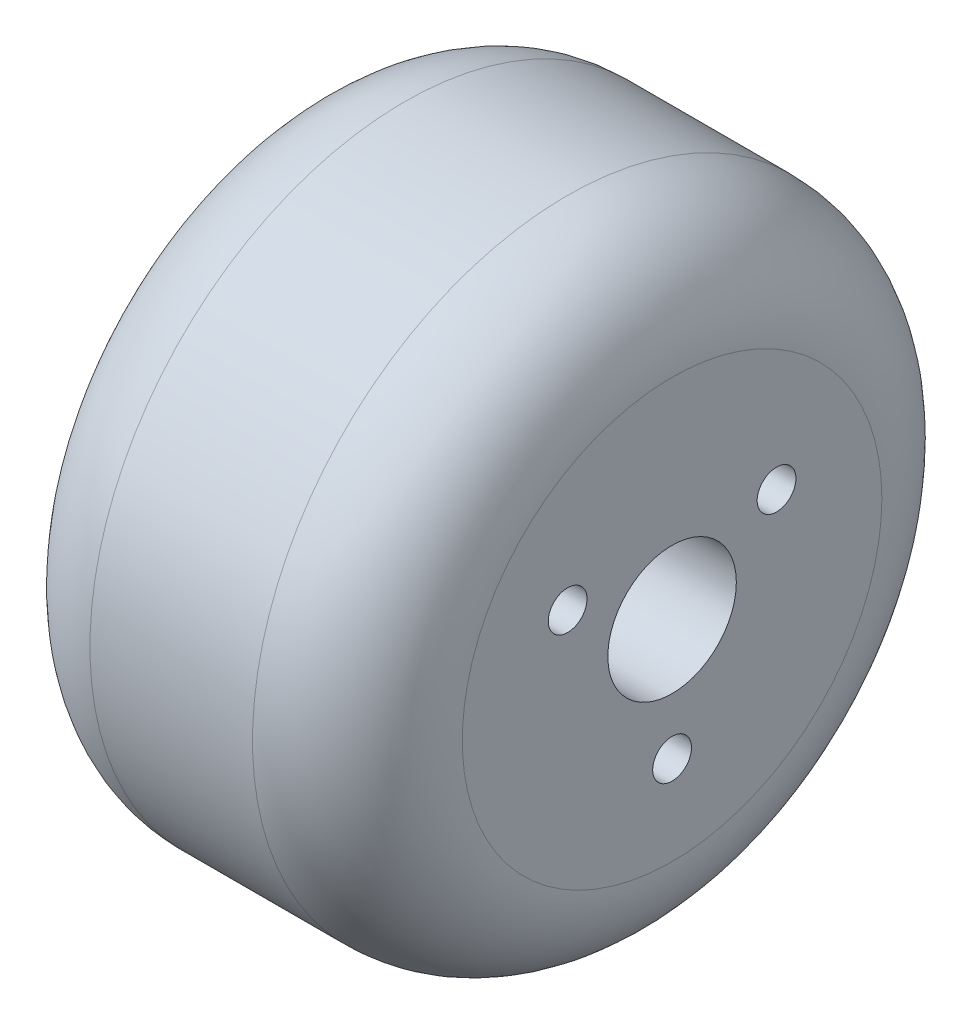
ISO-10303-21;
HEADER;
FILE_DESCRIPTION(('STEP AP214'),'2;1');
FILE_NAME('part.step','',(''),(''),'','','');
FILE_SCHEMA(('AUTOMOTIVE_DESIGN { 1 0 10303 214 1 1 1 1 }'));
ENDSEC;
DATA;
#1=APPLICATION_CONTEXT('core data for automotive mechanical design processes');
#2=APPLICATION_PROTOCOL_DEFINITION('international standard','automotive_design',2000,#1);
#3=PRODUCT_CONTEXT('',#1,'mechanical');
#4=PRODUCT('Part','Part','',(#3));
#5=PRODUCT_RELATED_PRODUCT_CATEGORY('part','',(#4));
#6=PRODUCT_DEFINITION_FORMATION('','',#4);
#7=PRODUCT_DEFINITION_CONTEXT('part definition',#1,'design');
#8=PRODUCT_DEFINITION('design','',#6,#7);
#9=PRODUCT_DEFINITION_SHAPE('','',#8);
#10=(LENGTH_UNIT() NAMED_UNIT(*) SI_UNIT(.MILLI.,.METRE.));
#11=(NAMED_UNIT(*) PLANE_ANGLE_UNIT() SI_UNIT($,.RADIAN.));
#12=(NAMED_UNIT(*) SI_UNIT($,.STERADIAN.) SOLID_ANGLE_UNIT());
#13=UNCERTAINTY_MEASURE_WITH_UNIT(LENGTH_MEASURE(1.E-05),#10,'distance_accuracy_value','');
#14=(GEOMETRIC_REPRESENTATION_CONTEXT(3) GLOBAL_UNCERTAINTY_ASSIGNED_CONTEXT((#13)) GLOBAL_UNIT_ASSIGNED_CONTEXT((#10,
#11,#12)) REPRESENTATION_CONTEXT('',''));
#15=CARTESIAN_POINT('',(0.,0.,0.));
#16=DIRECTION('',(0.,0.,1.));
#17=DIRECTION('',(1.,0.,0.));
#18=AXIS2_PLACEMENT_3D('',#15,#16,#17);
#19=CARTESIAN_POINT('',(35.5,0.,0.));
#20=DIRECTION('',(-1.,0.,0.));
#21=DIRECTION('',(0.,0.,1.));
#22=AXIS2_PLACEMENT_3D('',#19,#20,#21);
#23=CYLINDRICAL_SURFACE('',#22,30.);
#24=CARTESIAN_POINT('',(10.,0.,0.));
#25=DIRECTION('',(1.,0.,0.));
#26=DIRECTION('',(0.,0.,-1.));
#27=AXIS2_PLACEMENT_3D('',#24,#25,#26);
#28=CIRCLE('',#27,30.);
#29=CARTESIAN_POINT('',(10.,0.,-30.));
#30=VERTEX_POINT('',#29);
#31=EDGE_CURVE('E42',#30,#30,#28,.T.);
#32=ORIENTED_EDGE('',*,*,#31,.T.);
#33=EDGE_LOOP('',(#32));
#34=FACE_BOUND('',#33,.T.);
#35=CARTESIAN_POINT('',(25.5,0.,0.));
#36=DIRECTION('',(1.,0.,0.));
#37=DIRECTION('',(0.,0.,-1.));
#38=AXIS2_PLACEMENT_3D('',#35,#36,#37);
#39=CIRCLE('',#38,30.);
#40=CARTESIAN_POINT('',(25.5,0.,-30.));
#41=VERTEX_POINT('',#40);
#42=EDGE_CURVE('E46',#41,#41,#39,.F.);
#43=ORIENTED_EDGE('',*,*,#42,.T.);
#44=EDGE_LOOP('',(#43));
#45=FACE_BOUND('',#44,.T.);
#46=ADVANCED_FACE('F31',(#34,#45),#23,.T.);
#47=CARTESIAN_POINT('',(35.5,0.,0.));
#48=DIRECTION('',(1.,0.,0.));
#49=DIRECTION('',(0.,0.,-1.));
#50=AXIS2_PLACEMENT_3D('',#47,#48,#49);
#51=PLANE('',#50);
#52=CARTESIAN_POINT('',(35.5,0.,0.));
#53=DIRECTION('',(1.,0.,0.));
#54=DIRECTION('',(0.,0.,-1.));
#55=AXIS2_PLACEMENT_3D('',#52,#53,#54);
#56=CIRCLE('',#55,20.);
#57=CARTESIAN_POINT('',(35.5,0.,-20.));
#58=VERTEX_POINT('',#57);
#59=EDGE_CURVE('E10',#58,#58,#56,.T.);
#60=ORIENTED_EDGE('',*,*,#59,.T.);
#61=EDGE_LOOP('',(#60));
#62=FACE_BOUND('',#61,.T.);
#63=CARTESIAN_POINT('',(35.5,5.74999999999997,9.95929214352106));
#64=DIRECTION('',(1.,0.,0.));
#65=DIRECTION('',(0.,0.,-1.));
#66=AXIS2_PLACEMENT_3D('',#63,#64,#65);
#67=CIRCLE('',#66,1.85);
#68=CARTESIAN_POINT('',(35.5,5.74999999999997,8.10929214352106));
#69=VERTEX_POINT('',#68);
#70=EDGE_CURVE('E70',#69,#69,#67,.T.);
#71=ORIENTED_EDGE('',*,*,#70,.F.);
#72=EDGE_LOOP('',(#71));
#73=FACE_BOUND('',#72,.T.);
#74=CARTESIAN_POINT('',(35.5,5.75000000000005,-9.95929214352102));
#75=DIRECTION('',(1.,0.,0.));
#76=DIRECTION('',(0.,0.,-1.));
#77=AXIS2_PLACEMENT_3D('',#74,#75,#76);
#78=CIRCLE('',#77,1.85);
#79=CARTESIAN_POINT('',(35.5,5.75000000000005,-11.809292143521));
#80=VERTEX_POINT('',#79);
#81=EDGE_CURVE('E64',#80,#80,#78,.T.);
#82=ORIENTED_EDGE('',*,*,#81,.F.);
#83=EDGE_LOOP('',(#82));
#84=FACE_BOUND('',#83,.T.);
#85=CARTESIAN_POINT('',(35.5,-11.5,0.));
#86=DIRECTION('',(1.,0.,0.));
#87=DIRECTION('',(0.,0.,-1.));
#88=AXIS2_PLACEMENT_3D('',#85,#86,#87);
#89=CIRCLE('',#88,1.85);
#90=CARTESIAN_POINT('',(35.5,-11.5,-1.85));
#91=VERTEX_POINT('',#90);
#92=EDGE_CURVE('E58',#91,#91,#89,.T.);
#93=ORIENTED_EDGE('',*,*,#92,.F.);
#94=EDGE_LOOP('',(#93));
#95=FACE_BOUND('',#94,.T.);
#96=CARTESIAN_POINT('',(35.5,0.,0.));
#97=DIRECTION('',(1.,0.,0.));
#98=DIRECTION('',(0.,0.,-1.));
#99=AXIS2_PLACEMENT_3D('',#96,#97,#98);
#100=CIRCLE('',#99,6.125);
#101=CARTESIAN_POINT('',(35.5,0.,-6.125));
#102=VERTEX_POINT('',#101);
#103=EDGE_CURVE('E52',#102,#102,#100,.T.);
#104=ORIENTED_EDGE('',*,*,#103,.F.);
#105=EDGE_LOOP('',(#104));
#106=FACE_BOUND('',#105,.T.);
#107=ADVANCED_FACE('F87',(#62,#73,#84,#95,#106),#51,.T.);
#108=CARTESIAN_POINT('',(0.,0.,0.));
#109=DIRECTION('',(1.,0.,0.));
#110=DIRECTION('',(0.,0.,-1.));
#111=AXIS2_PLACEMENT_3D('',#108,#109,#110);
#112=PLANE('',#111);
#113=CARTESIAN_POINT('',(0.,0.,0.));
#114=DIRECTION('',(1.,0.,0.));
#115=DIRECTION('',(0.,0.,-1.));
#116=AXIS2_PLACEMENT_3D('',#113,#114,#115);
#117=CIRCLE('',#116,20.);
#118=CARTESIAN_POINT('',(0.,0.,-20.));
#119=VERTEX_POINT('',#118);
#120=EDGE_CURVE('E38',#119,#119,#117,.F.);
#121=ORIENTED_EDGE('',*,*,#120,.T.);
#122=EDGE_LOOP('',(#121));
#123=FACE_BOUND('',#122,.T.);
#124=CARTESIAN_POINT('',(0.,5.74999999999997,9.95929214352106));
#125=DIRECTION('',(1.,0.,0.));
#126=DIRECTION('',(0.,0.,-1.));
#127=AXIS2_PLACEMENT_3D('',#124,#125,#126);
#128=CIRCLE('',#127,1.85);
#129=CARTESIAN_POINT('',(0.,5.74999999999997,8.10929214352106));
#130=VERTEX_POINT('',#129);
#131=EDGE_CURVE('E55',#130,#130,#128,.T.);
#132=ORIENTED_EDGE('',*,*,#131,.T.);
#133=EDGE_LOOP('',(#132));
#134=FACE_BOUND('',#133,.T.);
#135=CARTESIAN_POINT('',(0.,5.75000000000005,-9.95929214352102));
#136=DIRECTION('',(1.,0.,0.));
#137=DIRECTION('',(0.,0.,-1.));
#138=AXIS2_PLACEMENT_3D('',#135,#136,#137);
#139=CIRCLE('',#138,1.85);
#140=CARTESIAN_POINT('',(0.,5.75000000000005,-11.809292143521));
#141=VERTEX_POINT('',#140);
#142=EDGE_CURVE('E67',#141,#141,#139,.T.);
#143=ORIENTED_EDGE('',*,*,#142,.T.);
#144=EDGE_LOOP('',(#143));
#145=FACE_BOUND('',#144,.T.);
#146=CARTESIAN_POINT('',(0.,-11.5,0.));
#147=DIRECTION('',(1.,0.,0.));
#148=DIRECTION('',(0.,0.,-1.));
#149=AXIS2_PLACEMENT_3D('',#146,#147,#148);
#150=CIRCLE('',#149,1.85);
#151=CARTESIAN_POINT('',(0.,-11.5,-1.85));
#152=VERTEX_POINT('',#151);
#153=EDGE_CURVE('E61',#152,#152,#150,.T.);
#154=ORIENTED_EDGE('',*,*,#153,.T.);
#155=EDGE_LOOP('',(#154));
#156=FACE_BOUND('',#155,.T.);
#157=CARTESIAN_POINT('',(0.,0.,0.));
#158=DIRECTION('',(1.,0.,0.));
#159=DIRECTION('',(0.,0.,-1.));
#160=AXIS2_PLACEMENT_3D('',#157,#158,#159);
#161=CIRCLE('',#160,6.125);
#162=CARTESIAN_POINT('',(0.,0.,-6.125));
#163=VERTEX_POINT('',#162);
#164=EDGE_CURVE('E51',#163,#163,#161,.T.);
#165=ORIENTED_EDGE('',*,*,#164,.T.);
#166=EDGE_LOOP('',(#165));
#167=FACE_BOUND('',#166,.T.);
#168=ADVANCED_FACE('F76',(#123,#134,#145,#156,#167),#112,.F.);
#169=CARTESIAN_POINT('',(0.,0.,0.));
#170=DIRECTION('',(1.,0.,0.));
#171=DIRECTION('',(0.,0.,-1.));
#172=AXIS2_PLACEMENT_3D('',#169,#170,#171);
#173=CYLINDRICAL_SURFACE('',#172,6.125);
#174=ORIENTED_EDGE('',*,*,#164,.F.);
#175=EDGE_LOOP('',(#174));
#176=FACE_BOUND('',#175,.T.);
#177=ORIENTED_EDGE('',*,*,#103,.T.);
#178=EDGE_LOOP('',(#177));
#179=FACE_BOUND('',#178,.T.);
#180=ADVANCED_FACE('F97',(#176,#179),#173,.F.);
#181=CARTESIAN_POINT('',(0.,-11.5,0.));
#182=DIRECTION('',(1.,0.,0.));
#183=DIRECTION('',(0.,0.,-1.));
#184=AXIS2_PLACEMENT_3D('',#181,#182,#183);
#185=CYLINDRICAL_SURFACE('',#184,1.85);
#186=ORIENTED_EDGE('',*,*,#153,.F.);
#187=EDGE_LOOP('',(#186));
#188=FACE_BOUND('',#187,.T.);
#189=ORIENTED_EDGE('',*,*,#92,.T.);
#190=EDGE_LOOP('',(#189));
#191=FACE_BOUND('',#190,.T.);
#192=ADVANCED_FACE('F99',(#188,#191),#185,.F.);
#193=CARTESIAN_POINT('',(0.,5.75000000000005,-9.95929214352102));
#194=DIRECTION('',(1.,0.,0.));
#195=DIRECTION('',(0.,0.,-1.));
#196=AXIS2_PLACEMENT_3D('',#193,#194,#195);
#197=CYLINDRICAL_SURFACE('',#196,1.85);
#198=ORIENTED_EDGE('',*,*,#142,.F.);
#199=EDGE_LOOP('',(#198));
#200=FACE_BOUND('',#199,.T.);
#201=ORIENTED_EDGE('',*,*,#81,.T.);
#202=EDGE_LOOP('',(#201));
#203=FACE_BOUND('',#202,.T.);
#204=ADVANCED_FACE('F83',(#200,#203),#197,.F.);
#205=CARTESIAN_POINT('',(0.,5.74999999999997,9.95929214352106));
#206=DIRECTION('',(1.,0.,0.));
#207=DIRECTION('',(0.,0.,-1.));
#208=AXIS2_PLACEMENT_3D('',#205,#206,#207);
#209=CYLINDRICAL_SURFACE('',#208,1.85);
#210=ORIENTED_EDGE('',*,*,#131,.F.);
#211=EDGE_LOOP('',(#210));
#212=FACE_BOUND('',#211,.T.);
#213=ORIENTED_EDGE('',*,*,#70,.T.);
#214=EDGE_LOOP('',(#213));
#215=FACE_BOUND('',#214,.T.);
#216=ADVANCED_FACE('F79',(#212,#215),#209,.F.);
#217=CARTESIAN_POINT('',(10.,0.,0.));
#218=DIRECTION('',(1.,0.,0.));
#219=DIRECTION('',(0.,0.,-1.));
#220=AXIS2_PLACEMENT_3D('',#217,#218,#219);
#221=TOROIDAL_SURFACE('',#220,20.,10.);
#222=ORIENTED_EDGE('',*,*,#120,.F.);
#223=EDGE_LOOP('',(#222));
#224=FACE_BOUND('',#223,.T.);
#225=ORIENTED_EDGE('',*,*,#31,.F.);
#226=EDGE_LOOP('',(#225));
#227=FACE_BOUND('',#226,.T.);
#228=ADVANCED_FACE('F82',(#224,#227),#221,.T.);
#229=CARTESIAN_POINT('',(25.5,0.,0.));
#230=DIRECTION('',(1.,0.,0.));
#231=DIRECTION('',(0.,0.,-1.));
#232=AXIS2_PLACEMENT_3D('',#229,#230,#231);
#233=TOROIDAL_SURFACE('',#232,20.,10.);
#234=ORIENTED_EDGE('',*,*,#42,.F.);
#235=EDGE_LOOP('',(#234));
#236=FACE_BOUND('',#235,.T.);
#237=ORIENTED_EDGE('',*,*,#59,.F.);
#238=EDGE_LOOP('',(#237));
#239=FACE_BOUND('',#238,.T.);
#240=ADVANCED_FACE('F33',(#236,#239),#233,.T.);
#241=CLOSED_SHELL('',(#46,#107,#168,#180,#192,#204,#216,#228,#240));
#242=MANIFOLD_SOLID_BREP('B2',#241);
#243=ADVANCED_BREP_SHAPE_REPRESENTATION('',(#18,#242),#14);
#244=SHAPE_DEFINITION_REPRESENTATION(#9,#243);
ENDSEC;
END-ISO-10303-21;
